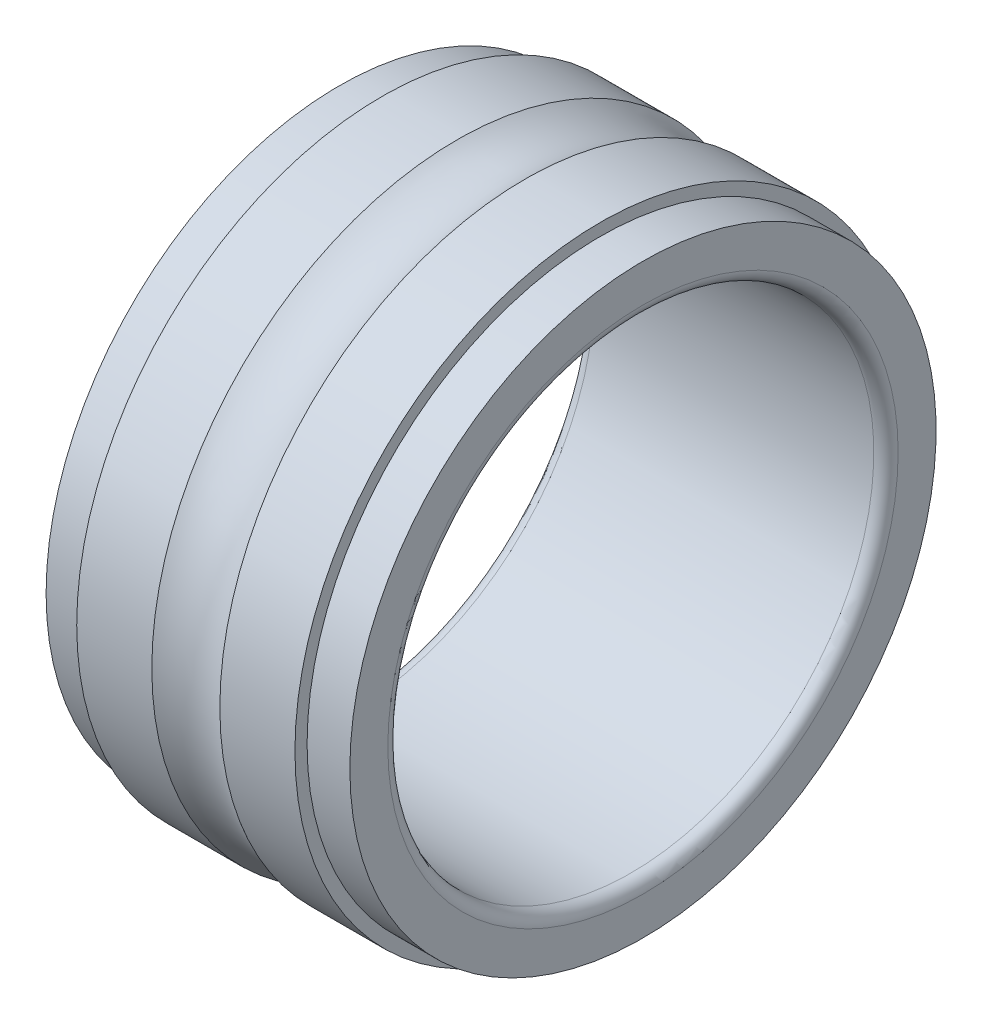
ISO-10303-21;
HEADER;
FILE_DESCRIPTION(('STEP AP214'),'2;1');
FILE_NAME('part.step','',(''),(''),'','','');
FILE_SCHEMA(('AUTOMOTIVE_DESIGN { 1 0 10303 214 1 1 1 1 }'));
ENDSEC;
DATA;
#1=APPLICATION_CONTEXT('core data for automotive mechanical design processes');
#2=APPLICATION_PROTOCOL_DEFINITION('international standard','automotive_design',2000,#1);
#3=PRODUCT_CONTEXT('',#1,'mechanical');
#4=PRODUCT('Part','Part','',(#3));
#5=PRODUCT_RELATED_PRODUCT_CATEGORY('part','',(#4));
#6=PRODUCT_DEFINITION_FORMATION('','',#4);
#7=PRODUCT_DEFINITION_CONTEXT('part definition',#1,'design');
#8=PRODUCT_DEFINITION('design','',#6,#7);
#9=PRODUCT_DEFINITION_SHAPE('','',#8);
#10=(LENGTH_UNIT() NAMED_UNIT(*) SI_UNIT(.MILLI.,.METRE.));
#11=(NAMED_UNIT(*) PLANE_ANGLE_UNIT() SI_UNIT($,.RADIAN.));
#12=(NAMED_UNIT(*) SI_UNIT($,.STERADIAN.) SOLID_ANGLE_UNIT());
#13=UNCERTAINTY_MEASURE_WITH_UNIT(LENGTH_MEASURE(1.E-05),#10,'distance_accuracy_value','');
#14=(GEOMETRIC_REPRESENTATION_CONTEXT(3) GLOBAL_UNCERTAINTY_ASSIGNED_CONTEXT((#13)) GLOBAL_UNIT_ASSIGNED_CONTEXT((#10,
#11,#12)) REPRESENTATION_CONTEXT('',''));
#15=CARTESIAN_POINT('',(0.,0.,0.));
#16=DIRECTION('',(0.,0.,1.));
#17=DIRECTION('',(1.,0.,0.));
#18=AXIS2_PLACEMENT_3D('',#15,#16,#17);
#19=CARTESIAN_POINT('',(2.5,0.,0.));
#20=DIRECTION('',(1.,0.,0.));
#21=DIRECTION('',(0.,1.,0.));
#22=AXIS2_PLACEMENT_3D('',#19,#20,#21);
#23=TOROIDAL_SURFACE('',#22,5.96250000000001,1.09200000000001);
#24=CARTESIAN_POINT('',(3.05996227551506,0.,0.));
#25=DIRECTION('',(-1.,0.,0.));
#26=DIRECTION('',(0.,0.,1.));
#27=AXIS2_PLACEMENT_3D('',#24,#25,#26);
#28=CIRCLE('',#27,5.025);
#29=CARTESIAN_POINT('',(3.05996227551506,0.,5.025));
#30=VERTEX_POINT('',#29);
#31=EDGE_CURVE('E166',#30,#30,#28,.F.);
#32=ORIENTED_EDGE('',*,*,#31,.F.);
#33=EDGE_LOOP('',(#32));
#34=FACE_BOUND('',#33,.T.);
#35=CARTESIAN_POINT('',(1.94003772448494,0.,0.));
#36=DIRECTION('',(-1.,0.,0.));
#37=DIRECTION('',(0.,0.,1.));
#38=AXIS2_PLACEMENT_3D('',#35,#36,#37);
#39=CIRCLE('',#38,5.025);
#40=CARTESIAN_POINT('',(1.94003772448494,0.,5.025));
#41=VERTEX_POINT('',#40);
#42=EDGE_CURVE('E163',#41,#41,#39,.T.);
#43=ORIENTED_EDGE('',*,*,#42,.F.);
#44=EDGE_LOOP('',(#43));
#45=FACE_BOUND('',#44,.T.);
#46=ADVANCED_FACE('F17',(#34,#45),#23,.F.);
#47=CARTESIAN_POINT('',(3.67798113775753,0.,0.));
#48=DIRECTION('',(-1.,0.,0.));
#49=DIRECTION('',(0.,0.,1.));
#50=AXIS2_PLACEMENT_3D('',#47,#48,#49);
#51=CYLINDRICAL_SURFACE('',#50,5.025);
#52=CARTESIAN_POINT('',(4.296,0.,0.));
#53=DIRECTION('',(-1.,0.,0.));
#54=DIRECTION('',(0.,0.,1.));
#55=AXIS2_PLACEMENT_3D('',#52,#53,#54);
#56=CIRCLE('',#55,5.025);
#57=CARTESIAN_POINT('',(4.296,0.,5.025));
#58=VERTEX_POINT('',#57);
#59=EDGE_CURVE('E165',#58,#58,#56,.F.);
#60=ORIENTED_EDGE('',*,*,#59,.F.);
#61=EDGE_LOOP('',(#60));
#62=FACE_BOUND('',#61,.T.);
#63=ORIENTED_EDGE('',*,*,#31,.T.);
#64=EDGE_LOOP('',(#63));
#65=FACE_BOUND('',#64,.T.);
#66=ADVANCED_FACE('F97',(#62,#65),#51,.T.);
#67=CARTESIAN_POINT('',(1.32201886224247,0.,0.));
#68=DIRECTION('',(-1.,0.,0.));
#69=DIRECTION('',(0.,0.,1.));
#70=AXIS2_PLACEMENT_3D('',#67,#68,#69);
#71=CYLINDRICAL_SURFACE('',#70,5.025);
#72=ORIENTED_EDGE('',*,*,#42,.T.);
#73=EDGE_LOOP('',(#72));
#74=FACE_BOUND('',#73,.T.);
#75=CARTESIAN_POINT('',(0.704,0.,0.));
#76=DIRECTION('',(-1.,0.,0.));
#77=DIRECTION('',(0.,0.,1.));
#78=AXIS2_PLACEMENT_3D('',#75,#76,#77);
#79=CIRCLE('',#78,5.025);
#80=CARTESIAN_POINT('',(0.704,0.,5.025));
#81=VERTEX_POINT('',#80);
#82=EDGE_CURVE('E183',#81,#81,#79,.T.);
#83=ORIENTED_EDGE('',*,*,#82,.F.);
#84=EDGE_LOOP('',(#83));
#85=FACE_BOUND('',#84,.T.);
#86=ADVANCED_FACE('F94',(#74,#85),#71,.T.);
#87=CARTESIAN_POINT('',(4.296,0.,-4.925));
#88=DIRECTION('',(1.,0.,0.));
#89=DIRECTION('',(0.,0.,-1.));
#90=AXIS2_PLACEMENT_3D('',#87,#88,#89);
#91=PLANE('',#90);
#92=ORIENTED_EDGE('',*,*,#59,.T.);
#93=EDGE_LOOP('',(#92));
#94=FACE_BOUND('',#93,.T.);
#95=CARTESIAN_POINT('',(4.296,0.,0.));
#96=DIRECTION('',(-1.,0.,0.));
#97=DIRECTION('',(0.,0.,1.));
#98=AXIS2_PLACEMENT_3D('',#95,#96,#97);
#99=CIRCLE('',#98,4.825);
#100=CARTESIAN_POINT('',(4.296,0.,4.825));
#101=VERTEX_POINT('',#100);
#102=EDGE_CURVE('E180',#101,#101,#99,.F.);
#103=ORIENTED_EDGE('',*,*,#102,.F.);
#104=EDGE_LOOP('',(#103));
#105=FACE_BOUND('',#104,.T.);
#106=ADVANCED_FACE('F90',(#94,#105),#91,.T.);
#107=CARTESIAN_POINT('',(0.704,0.,-4.925));
#108=DIRECTION('',(-1.,0.,0.));
#109=DIRECTION('',(0.,0.,1.));
#110=AXIS2_PLACEMENT_3D('',#107,#108,#109);
#111=PLANE('',#110);
#112=CARTESIAN_POINT('',(0.704,0.,0.));
#113=DIRECTION('',(-1.,0.,0.));
#114=DIRECTION('',(0.,0.,1.));
#115=AXIS2_PLACEMENT_3D('',#112,#113,#114);
#116=CIRCLE('',#115,4.825);
#117=CARTESIAN_POINT('',(0.704,0.,4.825));
#118=VERTEX_POINT('',#117);
#119=EDGE_CURVE('E177',#118,#118,#116,.T.);
#120=ORIENTED_EDGE('',*,*,#119,.F.);
#121=EDGE_LOOP('',(#120));
#122=FACE_BOUND('',#121,.T.);
#123=ORIENTED_EDGE('',*,*,#82,.T.);
#124=EDGE_LOOP('',(#123));
#125=FACE_BOUND('',#124,.T.);
#126=ADVANCED_FACE('F86',(#122,#125),#111,.T.);
#127=CARTESIAN_POINT('',(4.648,0.,0.));
#128=DIRECTION('',(-1.,0.,0.));
#129=DIRECTION('',(0.,0.,1.));
#130=AXIS2_PLACEMENT_3D('',#127,#128,#129);
#131=CYLINDRICAL_SURFACE('',#130,4.825);
#132=CARTESIAN_POINT('',(5.,0.,0.));
#133=DIRECTION('',(-1.,0.,0.));
#134=DIRECTION('',(0.,0.,1.));
#135=AXIS2_PLACEMENT_3D('',#132,#133,#134);
#136=CIRCLE('',#135,4.825);
#137=CARTESIAN_POINT('',(5.,0.,4.825));
#138=VERTEX_POINT('',#137);
#139=EDGE_CURVE('E174',#138,#138,#136,.F.);
#140=ORIENTED_EDGE('',*,*,#139,.F.);
#141=EDGE_LOOP('',(#140));
#142=FACE_BOUND('',#141,.T.);
#143=ORIENTED_EDGE('',*,*,#102,.T.);
#144=EDGE_LOOP('',(#143));
#145=FACE_BOUND('',#144,.T.);
#146=ADVANCED_FACE('F82',(#142,#145),#131,.T.);
#147=CARTESIAN_POINT('',(0.352,0.,0.));
#148=DIRECTION('',(-1.,0.,0.));
#149=DIRECTION('',(0.,0.,1.));
#150=AXIS2_PLACEMENT_3D('',#147,#148,#149);
#151=CYLINDRICAL_SURFACE('',#150,4.825);
#152=ORIENTED_EDGE('',*,*,#119,.T.);
#153=EDGE_LOOP('',(#152));
#154=FACE_BOUND('',#153,.T.);
#155=CARTESIAN_POINT('',(0.,0.,0.));
#156=DIRECTION('',(-1.,0.,0.));
#157=DIRECTION('',(0.,0.,1.));
#158=AXIS2_PLACEMENT_3D('',#155,#156,#157);
#159=CIRCLE('',#158,4.825);
#160=CARTESIAN_POINT('',(0.,0.,4.825));
#161=VERTEX_POINT('',#160);
#162=EDGE_CURVE('E171',#161,#161,#159,.T.);
#163=ORIENTED_EDGE('',*,*,#162,.F.);
#164=EDGE_LOOP('',(#163));
#165=FACE_BOUND('',#164,.T.);
#166=ADVANCED_FACE('F76',(#154,#165),#151,.T.);
#167=CARTESIAN_POINT('',(5.,0.,-4.5125));
#168=DIRECTION('',(1.,0.,0.));
#169=DIRECTION('',(0.,0.,-1.));
#170=AXIS2_PLACEMENT_3D('',#167,#168,#169);
#171=PLANE('',#170);
#172=ORIENTED_EDGE('',*,*,#139,.T.);
#173=EDGE_LOOP('',(#172));
#174=FACE_BOUND('',#173,.T.);
#175=CARTESIAN_POINT('',(5.,0.,0.));
#176=DIRECTION('',(1.,0.,0.));
#177=DIRECTION('',(0.,0.,-1.));
#178=AXIS2_PLACEMENT_3D('',#175,#176,#177);
#179=CIRCLE('',#178,4.2);
#180=CARTESIAN_POINT('',(5.,0.,-4.2));
#181=VERTEX_POINT('',#180);
#182=CARTESIAN_POINT('',(5.,0.,4.2));
#183=VERTEX_POINT('',#182);
#184=EDGE_CURVE('E46',#181,#183,#179,.T.);
#185=ORIENTED_EDGE('',*,*,#184,.F.);
#186=CARTESIAN_POINT('',(5.,0.,0.));
#187=DIRECTION('',(1.,0.,0.));
#188=DIRECTION('',(0.,0.,1.));
#189=AXIS2_PLACEMENT_3D('',#186,#187,#188);
#190=CIRCLE('',#189,4.2);
#191=EDGE_CURVE('E50',#183,#181,#190,.T.);
#192=ORIENTED_EDGE('',*,*,#191,.F.);
#193=EDGE_LOOP('',(#185,#192));
#194=FACE_BOUND('',#193,.T.);
#195=ADVANCED_FACE('F56',(#174,#194),#171,.T.);
#196=CARTESIAN_POINT('',(0.,0.,-4.5125));
#197=DIRECTION('',(-1.,0.,0.));
#198=DIRECTION('',(0.,0.,1.));
#199=AXIS2_PLACEMENT_3D('',#196,#197,#198);
#200=PLANE('',#199);
#201=CARTESIAN_POINT('',(0.,0.,0.));
#202=DIRECTION('',(-1.,0.,0.));
#203=DIRECTION('',(0.,0.,1.));
#204=AXIS2_PLACEMENT_3D('',#201,#202,#203);
#205=CIRCLE('',#204,4.2);
#206=CARTESIAN_POINT('',(0.,0.,4.2));
#207=VERTEX_POINT('',#206);
#208=CARTESIAN_POINT('',(0.,0.,-4.2));
#209=VERTEX_POINT('',#208);
#210=EDGE_CURVE('E35',#207,#209,#205,.T.);
#211=ORIENTED_EDGE('',*,*,#210,.F.);
#212=CARTESIAN_POINT('',(0.,0.,0.));
#213=DIRECTION('',(-1.,0.,0.));
#214=DIRECTION('',(0.,0.,-1.));
#215=AXIS2_PLACEMENT_3D('',#212,#213,#214);
#216=CIRCLE('',#215,4.2);
#217=EDGE_CURVE('E57',#209,#207,#216,.T.);
#218=ORIENTED_EDGE('',*,*,#217,.F.);
#219=EDGE_LOOP('',(#211,#218));
#220=FACE_BOUND('',#219,.T.);
#221=ORIENTED_EDGE('',*,*,#162,.T.);
#222=EDGE_LOOP('',(#221));
#223=FACE_BOUND('',#222,.T.);
#224=ADVANCED_FACE('F75',(#220,#223),#200,.T.);
#225=CARTESIAN_POINT('',(4.8,0.,0.));
#226=DIRECTION('',(1.,0.,0.));
#227=DIRECTION('',(0.,1.,0.));
#228=AXIS2_PLACEMENT_3D('',#225,#226,#227);
#229=TOROIDAL_SURFACE('',#228,4.2,0.199999999999999);
#230=ORIENTED_EDGE('',*,*,#184,.T.);
#231=ORIENTED_EDGE('',*,*,#191,.T.);
#232=EDGE_LOOP('',(#230,#231));
#233=FACE_BOUND('',#232,.T.);
#234=CARTESIAN_POINT('',(4.8,0.,0.));
#235=DIRECTION('',(-1.,0.,0.));
#236=DIRECTION('',(0.,0.,1.));
#237=AXIS2_PLACEMENT_3D('',#234,#235,#236);
#238=CIRCLE('',#237,4.);
#239=CARTESIAN_POINT('',(4.8,0.,4.));
#240=VERTEX_POINT('',#239);
#241=EDGE_CURVE('E29',#240,#240,#238,.T.);
#242=ORIENTED_EDGE('',*,*,#241,.T.);
#243=EDGE_LOOP('',(#242));
#244=FACE_BOUND('',#243,.T.);
#245=ADVANCED_FACE('F48',(#233,#244),#229,.T.);
#246=CARTESIAN_POINT('',(0.2,0.,0.));
#247=DIRECTION('',(1.,0.,0.));
#248=DIRECTION('',(0.,1.,0.));
#249=AXIS2_PLACEMENT_3D('',#246,#247,#248);
#250=TOROIDAL_SURFACE('',#249,4.2,0.2);
#251=CARTESIAN_POINT('',(0.2,0.,0.));
#252=DIRECTION('',(-1.,0.,0.));
#253=DIRECTION('',(0.,0.,1.));
#254=AXIS2_PLACEMENT_3D('',#251,#252,#253);
#255=CIRCLE('',#254,4.);
#256=CARTESIAN_POINT('',(0.2,0.,4.));
#257=VERTEX_POINT('',#256);
#258=EDGE_CURVE('E11',#257,#257,#255,.F.);
#259=ORIENTED_EDGE('',*,*,#258,.T.);
#260=EDGE_LOOP('',(#259));
#261=FACE_BOUND('',#260,.T.);
#262=ORIENTED_EDGE('',*,*,#217,.T.);
#263=ORIENTED_EDGE('',*,*,#210,.T.);
#264=EDGE_LOOP('',(#262,#263));
#265=FACE_BOUND('',#264,.T.);
#266=ADVANCED_FACE('F110',(#261,#265),#250,.T.);
#267=CARTESIAN_POINT('',(2.5,0.,0.));
#268=DIRECTION('',(-1.,0.,0.));
#269=DIRECTION('',(0.,0.,1.));
#270=AXIS2_PLACEMENT_3D('',#267,#268,#269);
#271=CYLINDRICAL_SURFACE('',#270,4.);
#272=ORIENTED_EDGE('',*,*,#258,.F.);
#273=EDGE_LOOP('',(#272));
#274=FACE_BOUND('',#273,.T.);
#275=ORIENTED_EDGE('',*,*,#241,.F.);
#276=EDGE_LOOP('',(#275));
#277=FACE_BOUND('',#276,.T.);
#278=ADVANCED_FACE('F108',(#274,#277),#271,.F.);
#279=CLOSED_SHELL('',(#46,#66,#86,#106,#126,#146,#166,#195,#224,#245,#266,#278));
#280=MANIFOLD_SOLID_BREP('B1',#279);
#281=ADVANCED_BREP_SHAPE_REPRESENTATION('',(#18,#280),#14);
#282=SHAPE_DEFINITION_REPRESENTATION(#9,#281);
ENDSEC;
END-ISO-10303-21;
